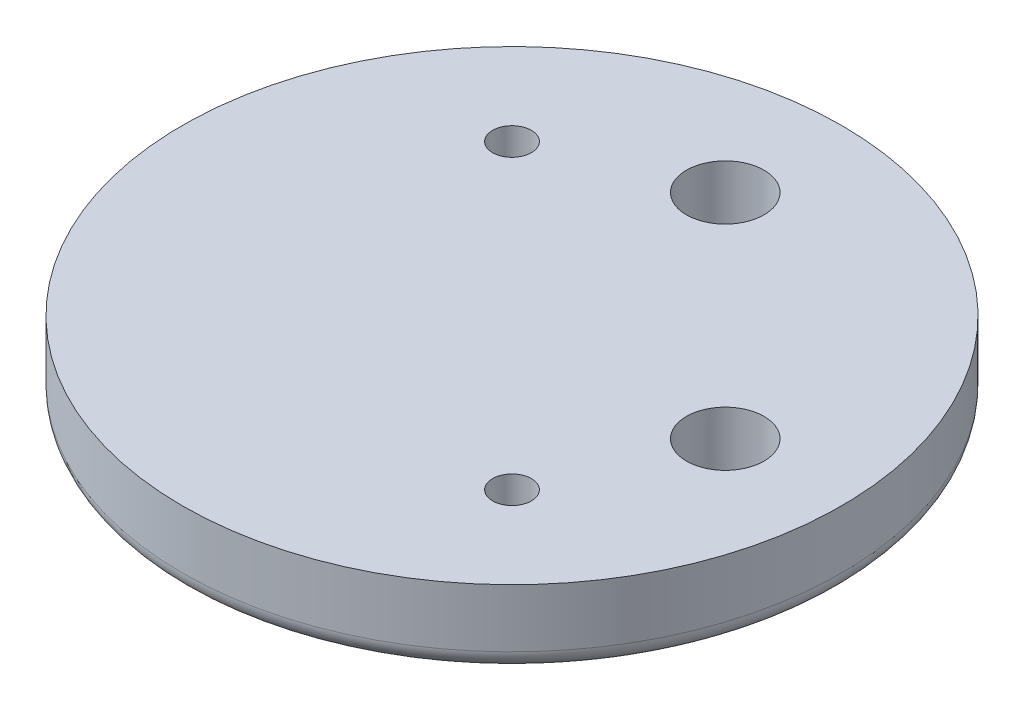
ISO-10303-21;
HEADER;
FILE_DESCRIPTION(('STEP AP214'),'2;1');
FILE_NAME('part.step','',(''),(''),'','','');
FILE_SCHEMA(('AUTOMOTIVE_DESIGN { 1 0 10303 214 1 1 1 1 }'));
ENDSEC;
DATA;
#1=APPLICATION_CONTEXT('core data for automotive mechanical design processes');
#2=APPLICATION_PROTOCOL_DEFINITION('international standard','automotive_design',2000,#1);
#3=PRODUCT_CONTEXT('',#1,'mechanical');
#4=PRODUCT('Part','Part','',(#3));
#5=PRODUCT_RELATED_PRODUCT_CATEGORY('part','',(#4));
#6=PRODUCT_DEFINITION_FORMATION('','',#4);
#7=PRODUCT_DEFINITION_CONTEXT('part definition',#1,'design');
#8=PRODUCT_DEFINITION('design','',#6,#7);
#9=PRODUCT_DEFINITION_SHAPE('','',#8);
#10=(LENGTH_UNIT() NAMED_UNIT(*) SI_UNIT(.MILLI.,.METRE.));
#11=(NAMED_UNIT(*) PLANE_ANGLE_UNIT() SI_UNIT($,.RADIAN.));
#12=(NAMED_UNIT(*) SI_UNIT($,.STERADIAN.) SOLID_ANGLE_UNIT());
#13=UNCERTAINTY_MEASURE_WITH_UNIT(LENGTH_MEASURE(1.E-05),#10,'distance_accuracy_value','');
#14=(GEOMETRIC_REPRESENTATION_CONTEXT(3) GLOBAL_UNCERTAINTY_ASSIGNED_CONTEXT((#13)) GLOBAL_UNIT_ASSIGNED_CONTEXT((#10,
#11,#12)) REPRESENTATION_CONTEXT('',''));
#15=CARTESIAN_POINT('',(0.,0.,0.));
#16=DIRECTION('',(0.,0.,1.));
#17=DIRECTION('',(1.,0.,0.));
#18=AXIS2_PLACEMENT_3D('',#15,#16,#17);
#19=CARTESIAN_POINT('',(0.,0.,0.));
#20=DIRECTION('',(0.,1.,0.));
#21=DIRECTION('',(0.,0.,1.));
#22=AXIS2_PLACEMENT_3D('',#19,#20,#21);
#23=PLANE('',#22);
#24=CARTESIAN_POINT('',(0.,0.,0.));
#25=DIRECTION('',(0.,1.,0.));
#26=DIRECTION('',(0.,0.,1.));
#27=AXIS2_PLACEMENT_3D('',#24,#25,#26);
#28=CIRCLE('',#27,16.);
#29=CARTESIAN_POINT('',(0.,0.,16.));
#30=VERTEX_POINT('',#29);
#31=EDGE_CURVE('E11',#30,#30,#28,.F.);
#32=ORIENTED_EDGE('',*,*,#31,.T.);
#33=EDGE_LOOP('',(#32));
#34=FACE_BOUND('',#33,.T.);
#35=CARTESIAN_POINT('',(0.,0.,-11.));
#36=DIRECTION('',(0.,1.,0.));
#37=DIRECTION('',(0.,0.,1.));
#38=AXIS2_PLACEMENT_3D('',#35,#36,#37);
#39=CIRCLE('',#38,2.);
#40=CARTESIAN_POINT('',(0.,0.,-9.));
#41=VERTEX_POINT('',#40);
#42=EDGE_CURVE('E106',#41,#41,#39,.F.);
#43=ORIENTED_EDGE('',*,*,#42,.F.);
#44=EDGE_LOOP('',(#43));
#45=FACE_BOUND('',#44,.T.);
#46=CARTESIAN_POINT('',(-7.77817459305198,0.,-7.77817459305206));
#47=DIRECTION('',(0.,1.,0.));
#48=DIRECTION('',(0.,0.,1.));
#49=AXIS2_PLACEMENT_3D('',#46,#47,#48);
#50=CIRCLE('',#49,1.);
#51=CARTESIAN_POINT('',(-7.77817459305198,0.,-6.77817459305206));
#52=VERTEX_POINT('',#51);
#53=EDGE_CURVE('E175',#52,#52,#50,.F.);
#54=ORIENTED_EDGE('',*,*,#53,.F.);
#55=EDGE_LOOP('',(#54));
#56=FACE_BOUND('',#55,.T.);
#57=CARTESIAN_POINT('',(11.,0.,0.));
#58=DIRECTION('',(0.,1.,0.));
#59=DIRECTION('',(0.,0.,1.));
#60=AXIS2_PLACEMENT_3D('',#57,#58,#59);
#61=CIRCLE('',#60,2.);
#62=CARTESIAN_POINT('',(11.,0.,2.00000000000004));
#63=VERTEX_POINT('',#62);
#64=EDGE_CURVE('E181',#63,#63,#61,.F.);
#65=ORIENTED_EDGE('',*,*,#64,.F.);
#66=EDGE_LOOP('',(#65));
#67=FACE_BOUND('',#66,.T.);
#68=CARTESIAN_POINT('',(7.77817459305203,0.,7.77817459305201));
#69=DIRECTION('',(0.,1.,0.));
#70=DIRECTION('',(0.,0.,1.));
#71=AXIS2_PLACEMENT_3D('',#68,#69,#70);
#72=CIRCLE('',#71,1.);
#73=CARTESIAN_POINT('',(7.77817459305203,0.,8.77817459305201));
#74=VERTEX_POINT('',#73);
#75=EDGE_CURVE('E188',#74,#74,#72,.F.);
#76=ORIENTED_EDGE('',*,*,#75,.F.);
#77=EDGE_LOOP('',(#76));
#78=FACE_BOUND('',#77,.T.);
#79=CARTESIAN_POINT('',(0.,0.,-4.5));
#80=DIRECTION('',(0.,1.,0.));
#81=DIRECTION('',(0.,0.,1.));
#82=AXIS2_PLACEMENT_3D('',#79,#80,#81);
#83=CIRCLE('',#82,2.5);
#84=CARTESIAN_POINT('',(2.5,0.,-4.5));
#85=VERTEX_POINT('',#84);
#86=CARTESIAN_POINT('',(-2.5,0.,-4.5));
#87=VERTEX_POINT('',#86);
#88=EDGE_CURVE('E50',#85,#87,#83,.T.);
#89=ORIENTED_EDGE('',*,*,#88,.T.);
#90=DIRECTION('',(0.,0.,1.));
#91=VECTOR('',#90,1.);
#92=CARTESIAN_POINT('',(-2.5,0.,-4.5));
#93=LINE('',#92,#91);
#94=CARTESIAN_POINT('',(-2.5,0.,4.5));
#95=VERTEX_POINT('',#94);
#96=EDGE_CURVE('E105',#87,#95,#93,.T.);
#97=ORIENTED_EDGE('',*,*,#96,.T.);
#98=CARTESIAN_POINT('',(0.,0.,4.5));
#99=DIRECTION('',(0.,1.,0.));
#100=DIRECTION('',(0.,0.,1.));
#101=AXIS2_PLACEMENT_3D('',#98,#99,#100);
#102=CIRCLE('',#101,2.5);
#103=CARTESIAN_POINT('',(2.5,0.,4.5));
#104=VERTEX_POINT('',#103);
#105=EDGE_CURVE('E95',#95,#104,#102,.T.);
#106=ORIENTED_EDGE('',*,*,#105,.T.);
#107=DIRECTION('',(0.,0.,-1.));
#108=VECTOR('',#107,1.);
#109=CARTESIAN_POINT('',(2.5,0.,-4.5));
#110=LINE('',#109,#108);
#111=EDGE_CURVE('E109',#104,#85,#110,.T.);
#112=ORIENTED_EDGE('',*,*,#111,.T.);
#113=EDGE_LOOP('',(#89,#97,#106,#112));
#114=FACE_BOUND('',#113,.T.);
#115=ADVANCED_FACE('F35',(#34,#45,#56,#67,#78,#114),#23,.F.);
#116=CARTESIAN_POINT('',(0.,4.,0.));
#117=DIRECTION('',(0.,-1.,0.));
#118=DIRECTION('',(0.,0.,-1.));
#119=AXIS2_PLACEMENT_3D('',#116,#117,#118);
#120=CYLINDRICAL_SURFACE('',#119,17.);
#121=CARTESIAN_POINT('',(0.,1.,0.));
#122=DIRECTION('',(0.,1.,0.));
#123=DIRECTION('',(0.,0.,1.));
#124=AXIS2_PLACEMENT_3D('',#121,#122,#123);
#125=CIRCLE('',#124,17.);
#126=CARTESIAN_POINT('',(0.,1.,17.));
#127=VERTEX_POINT('',#126);
#128=EDGE_CURVE('E43',#127,#127,#125,.T.);
#129=ORIENTED_EDGE('',*,*,#128,.T.);
#130=EDGE_LOOP('',(#129));
#131=FACE_BOUND('',#130,.T.);
#132=CARTESIAN_POINT('',(0.,4.,0.));
#133=DIRECTION('',(0.,1.,0.));
#134=DIRECTION('',(0.,0.,1.));
#135=AXIS2_PLACEMENT_3D('',#132,#133,#134);
#136=CIRCLE('',#135,17.);
#137=CARTESIAN_POINT('',(0.,4.,17.));
#138=VERTEX_POINT('',#137);
#139=EDGE_CURVE('E115',#138,#138,#136,.T.);
#140=ORIENTED_EDGE('',*,*,#139,.F.);
#141=EDGE_LOOP('',(#140));
#142=FACE_BOUND('',#141,.T.);
#143=ADVANCED_FACE('F120',(#131,#142),#120,.T.);
#144=CARTESIAN_POINT('',(0.,4.,0.));
#145=DIRECTION('',(0.,1.,0.));
#146=DIRECTION('',(0.,0.,1.));
#147=AXIS2_PLACEMENT_3D('',#144,#145,#146);
#148=PLANE('',#147);
#149=CARTESIAN_POINT('',(0.,4.,-11.));
#150=DIRECTION('',(0.,1.,0.));
#151=DIRECTION('',(0.,0.,1.));
#152=AXIS2_PLACEMENT_3D('',#149,#150,#151);
#153=CIRCLE('',#152,2.);
#154=CARTESIAN_POINT('',(0.,4.,-9.));
#155=VERTEX_POINT('',#154);
#156=EDGE_CURVE('E177',#155,#155,#153,.T.);
#157=ORIENTED_EDGE('',*,*,#156,.F.);
#158=EDGE_LOOP('',(#157));
#159=FACE_BOUND('',#158,.T.);
#160=CARTESIAN_POINT('',(-7.77817459305198,4.,-7.77817459305206));
#161=DIRECTION('',(0.,1.,0.));
#162=DIRECTION('',(0.,0.,1.));
#163=AXIS2_PLACEMENT_3D('',#160,#161,#162);
#164=CIRCLE('',#163,1.);
#165=CARTESIAN_POINT('',(-7.77817459305198,4.,-6.77817459305206));
#166=VERTEX_POINT('',#165);
#167=EDGE_CURVE('E172',#166,#166,#164,.T.);
#168=ORIENTED_EDGE('',*,*,#167,.F.);
#169=EDGE_LOOP('',(#168));
#170=FACE_BOUND('',#169,.T.);
#171=CARTESIAN_POINT('',(11.,4.,0.));
#172=DIRECTION('',(0.,1.,0.));
#173=DIRECTION('',(0.,0.,-1.));
#174=AXIS2_PLACEMENT_3D('',#171,#172,#173);
#175=CIRCLE('',#174,2.);
#176=CARTESIAN_POINT('',(11.,4.,-1.99999999999996));
#177=VERTEX_POINT('',#176);
#178=EDGE_CURVE('E185',#177,#177,#175,.T.);
#179=ORIENTED_EDGE('',*,*,#178,.F.);
#180=EDGE_LOOP('',(#179));
#181=FACE_BOUND('',#180,.T.);
#182=CARTESIAN_POINT('',(7.77817459305203,4.,7.77817459305201));
#183=DIRECTION('',(0.,1.,0.));
#184=DIRECTION('',(0.,0.,-1.));
#185=AXIS2_PLACEMENT_3D('',#182,#183,#184);
#186=CIRCLE('',#185,1.);
#187=CARTESIAN_POINT('',(7.77817459305203,4.,6.77817459305201));
#188=VERTEX_POINT('',#187);
#189=EDGE_CURVE('E191',#188,#188,#186,.T.);
#190=ORIENTED_EDGE('',*,*,#189,.F.);
#191=EDGE_LOOP('',(#190));
#192=FACE_BOUND('',#191,.T.);
#193=ORIENTED_EDGE('',*,*,#139,.T.);
#194=EDGE_LOOP('',(#193));
#195=FACE_BOUND('',#194,.T.);
#196=ADVANCED_FACE('F139',(#159,#170,#181,#192,#195),#148,.T.);
#197=CARTESIAN_POINT('',(0.,2.,-4.5));
#198=DIRECTION('',(0.,-1.,0.));
#199=DIRECTION('',(0.,0.,-1.));
#200=AXIS2_PLACEMENT_3D('',#197,#198,#199);
#201=CYLINDRICAL_SURFACE('',#200,2.5);
#202=ORIENTED_EDGE('',*,*,#88,.F.);
#203=DIRECTION('',(0.,-1.,0.));
#204=VECTOR('',#203,1.);
#205=CARTESIAN_POINT('',(2.5,2.,-4.5));
#206=LINE('',#205,#204);
#207=CARTESIAN_POINT('',(2.5,2.,-4.5));
#208=VERTEX_POINT('',#207);
#209=EDGE_CURVE('E100',#208,#85,#206,.T.);
#210=ORIENTED_EDGE('',*,*,#209,.F.);
#211=CARTESIAN_POINT('',(0.,2.,-4.5));
#212=DIRECTION('',(0.,1.,0.));
#213=DIRECTION('',(0.,0.,1.));
#214=AXIS2_PLACEMENT_3D('',#211,#212,#213);
#215=CIRCLE('',#214,2.5);
#216=CARTESIAN_POINT('',(-2.5,2.,-4.5));
#217=VERTEX_POINT('',#216);
#218=EDGE_CURVE('E91',#208,#217,#215,.T.);
#219=ORIENTED_EDGE('',*,*,#218,.T.);
#220=DIRECTION('',(0.,-1.,0.));
#221=VECTOR('',#220,1.);
#222=CARTESIAN_POINT('',(-2.5,2.,-4.5));
#223=LINE('',#222,#221);
#224=EDGE_CURVE('E89',#217,#87,#223,.T.);
#225=ORIENTED_EDGE('',*,*,#224,.T.);
#226=EDGE_LOOP('',(#202,#210,#219,#225));
#227=FACE_BOUND('',#226,.T.);
#228=ADVANCED_FACE('F144',(#227),#201,.F.);
#229=CARTESIAN_POINT('',(-2.5,2.,-4.5));
#230=DIRECTION('',(1.,0.,0.));
#231=DIRECTION('',(0.,0.,-1.));
#232=AXIS2_PLACEMENT_3D('',#229,#230,#231);
#233=PLANE('',#232);
#234=ORIENTED_EDGE('',*,*,#96,.F.);
#235=ORIENTED_EDGE('',*,*,#224,.F.);
#236=DIRECTION('',(0.,0.,1.));
#237=VECTOR('',#236,1.);
#238=CARTESIAN_POINT('',(-2.5,2.,-4.5));
#239=LINE('',#238,#237);
#240=CARTESIAN_POINT('',(-2.5,2.,4.5));
#241=VERTEX_POINT('',#240);
#242=EDGE_CURVE('E82',#217,#241,#239,.T.);
#243=ORIENTED_EDGE('',*,*,#242,.T.);
#244=DIRECTION('',(0.,-1.,0.));
#245=VECTOR('',#244,1.);
#246=CARTESIAN_POINT('',(-2.5,2.,4.5));
#247=LINE('',#246,#245);
#248=EDGE_CURVE('E88',#241,#95,#247,.T.);
#249=ORIENTED_EDGE('',*,*,#248,.T.);
#250=EDGE_LOOP('',(#234,#235,#243,#249));
#251=FACE_BOUND('',#250,.T.);
#252=ADVANCED_FACE('F87',(#251),#233,.T.);
#253=CARTESIAN_POINT('',(0.,2.,4.5));
#254=DIRECTION('',(0.,-1.,0.));
#255=DIRECTION('',(0.,0.,-1.));
#256=AXIS2_PLACEMENT_3D('',#253,#254,#255);
#257=CYLINDRICAL_SURFACE('',#256,2.5);
#258=ORIENTED_EDGE('',*,*,#105,.F.);
#259=ORIENTED_EDGE('',*,*,#248,.F.);
#260=CARTESIAN_POINT('',(0.,2.,4.5));
#261=DIRECTION('',(0.,1.,0.));
#262=DIRECTION('',(0.,0.,1.));
#263=AXIS2_PLACEMENT_3D('',#260,#261,#262);
#264=CIRCLE('',#263,2.5);
#265=CARTESIAN_POINT('',(2.5,2.,4.5));
#266=VERTEX_POINT('',#265);
#267=EDGE_CURVE('E90',#241,#266,#264,.T.);
#268=ORIENTED_EDGE('',*,*,#267,.T.);
#269=DIRECTION('',(0.,-1.,0.));
#270=VECTOR('',#269,1.);
#271=CARTESIAN_POINT('',(2.5,2.,4.5));
#272=LINE('',#271,#270);
#273=EDGE_CURVE('E74',#266,#104,#272,.T.);
#274=ORIENTED_EDGE('',*,*,#273,.T.);
#275=EDGE_LOOP('',(#258,#259,#268,#274));
#276=FACE_BOUND('',#275,.T.);
#277=ADVANCED_FACE('F93',(#276),#257,.F.);
#278=CARTESIAN_POINT('',(2.5,2.,-4.5));
#279=DIRECTION('',(-1.,0.,0.));
#280=DIRECTION('',(0.,0.,1.));
#281=AXIS2_PLACEMENT_3D('',#278,#279,#280);
#282=PLANE('',#281);
#283=ORIENTED_EDGE('',*,*,#111,.F.);
#284=ORIENTED_EDGE('',*,*,#273,.F.);
#285=DIRECTION('',(0.,0.,-1.));
#286=VECTOR('',#285,1.);
#287=CARTESIAN_POINT('',(2.5,2.,-4.5));
#288=LINE('',#287,#286);
#289=EDGE_CURVE('E58',#266,#208,#288,.T.);
#290=ORIENTED_EDGE('',*,*,#289,.T.);
#291=ORIENTED_EDGE('',*,*,#209,.T.);
#292=EDGE_LOOP('',(#283,#284,#290,#291));
#293=FACE_BOUND('',#292,.T.);
#294=ADVANCED_FACE('F152',(#293),#282,.T.);
#295=CARTESIAN_POINT('',(0.,2.,-4.5));
#296=DIRECTION('',(0.,1.,0.));
#297=DIRECTION('',(0.,0.,1.));
#298=AXIS2_PLACEMENT_3D('',#295,#296,#297);
#299=PLANE('',#298);
#300=ORIENTED_EDGE('',*,*,#218,.F.);
#301=ORIENTED_EDGE('',*,*,#289,.F.);
#302=ORIENTED_EDGE('',*,*,#267,.F.);
#303=ORIENTED_EDGE('',*,*,#242,.F.);
#304=EDGE_LOOP('',(#300,#301,#302,#303));
#305=FACE_BOUND('',#304,.T.);
#306=ADVANCED_FACE('F98',(#305),#299,.F.);
#307=CARTESIAN_POINT('',(7.77817459305203,-0.00100000000000013,7.77817459305201));
#308=DIRECTION('',(0.,1.,0.));
#309=DIRECTION('',(0.,0.,1.));
#310=AXIS2_PLACEMENT_3D('',#307,#308,#309);
#311=CYLINDRICAL_SURFACE('',#310,1.);
#312=ORIENTED_EDGE('',*,*,#189,.T.);
#313=EDGE_LOOP('',(#312));
#314=FACE_BOUND('',#313,.T.);
#315=ORIENTED_EDGE('',*,*,#75,.T.);
#316=EDGE_LOOP('',(#315));
#317=FACE_BOUND('',#316,.T.);
#318=ADVANCED_FACE('F157',(#314,#317),#311,.F.);
#319=CARTESIAN_POINT('',(11.,-0.00100000000000013,0.));
#320=DIRECTION('',(0.,1.,0.));
#321=DIRECTION('',(0.,0.,1.));
#322=AXIS2_PLACEMENT_3D('',#319,#320,#321);
#323=CYLINDRICAL_SURFACE('',#322,2.);
#324=ORIENTED_EDGE('',*,*,#178,.T.);
#325=EDGE_LOOP('',(#324));
#326=FACE_BOUND('',#325,.T.);
#327=ORIENTED_EDGE('',*,*,#64,.T.);
#328=EDGE_LOOP('',(#327));
#329=FACE_BOUND('',#328,.T.);
#330=ADVANCED_FACE('F160',(#326,#329),#323,.F.);
#331=CARTESIAN_POINT('',(-7.77817459305198,-0.00100000000000013,-7.77817459305206));
#332=DIRECTION('',(0.,1.,0.));
#333=DIRECTION('',(0.,0.,1.));
#334=AXIS2_PLACEMENT_3D('',#331,#332,#333);
#335=CYLINDRICAL_SURFACE('',#334,1.);
#336=ORIENTED_EDGE('',*,*,#167,.T.);
#337=EDGE_LOOP('',(#336));
#338=FACE_BOUND('',#337,.T.);
#339=ORIENTED_EDGE('',*,*,#53,.T.);
#340=EDGE_LOOP('',(#339));
#341=FACE_BOUND('',#340,.T.);
#342=ADVANCED_FACE('F129',(#338,#341),#335,.F.);
#343=CARTESIAN_POINT('',(0.,-0.00100000000000013,-11.));
#344=DIRECTION('',(0.,1.,0.));
#345=DIRECTION('',(0.,0.,1.));
#346=AXIS2_PLACEMENT_3D('',#343,#344,#345);
#347=CYLINDRICAL_SURFACE('',#346,2.);
#348=ORIENTED_EDGE('',*,*,#156,.T.);
#349=EDGE_LOOP('',(#348));
#350=FACE_BOUND('',#349,.T.);
#351=ORIENTED_EDGE('',*,*,#42,.T.);
#352=EDGE_LOOP('',(#351));
#353=FACE_BOUND('',#352,.T.);
#354=ADVANCED_FACE('F124',(#350,#353),#347,.F.);
#355=CARTESIAN_POINT('',(0.,1.,0.));
#356=DIRECTION('',(0.,1.,0.));
#357=DIRECTION('',(0.,0.,1.));
#358=AXIS2_PLACEMENT_3D('',#355,#356,#357);
#359=TOROIDAL_SURFACE('',#358,16.,1.);
#360=ORIENTED_EDGE('',*,*,#31,.F.);
#361=EDGE_LOOP('',(#360));
#362=FACE_BOUND('',#361,.T.);
#363=ORIENTED_EDGE('',*,*,#128,.F.);
#364=EDGE_LOOP('',(#363));
#365=FACE_BOUND('',#364,.T.);
#366=ADVANCED_FACE('F37',(#362,#365),#359,.T.);
#367=CLOSED_SHELL('',(#115,#143,#196,#228,#252,#277,#294,#306,#318,#330,#342,#354,#366));
#368=MANIFOLD_SOLID_BREP('B2',#367);
#369=ADVANCED_BREP_SHAPE_REPRESENTATION('',(#18,#368),#14);
#370=SHAPE_DEFINITION_REPRESENTATION(#9,#369);
ENDSEC;
END-ISO-10303-21;
